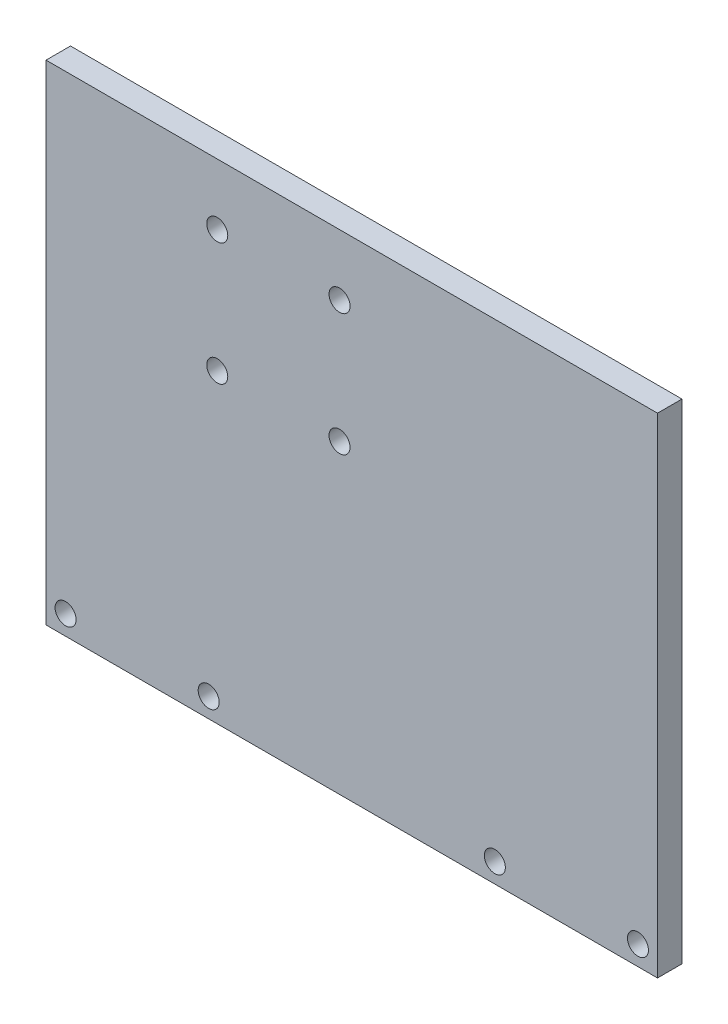
ISO-10303-21;
HEADER;
FILE_DESCRIPTION(('STEP AP214'),'2;1');
FILE_NAME('part.step','',(''),(''),'','','');
FILE_SCHEMA(('AUTOMOTIVE_DESIGN { 1 0 10303 214 1 1 1 1 }'));
ENDSEC;
DATA;
#1=APPLICATION_CONTEXT('core data for automotive mechanical design processes');
#2=APPLICATION_PROTOCOL_DEFINITION('international standard','automotive_design',2000,#1);
#3=PRODUCT_CONTEXT('',#1,'mechanical');
#4=PRODUCT('Part','Part','',(#3));
#5=PRODUCT_RELATED_PRODUCT_CATEGORY('part','',(#4));
#6=PRODUCT_DEFINITION_FORMATION('','',#4);
#7=PRODUCT_DEFINITION_CONTEXT('part definition',#1,'design');
#8=PRODUCT_DEFINITION('design','',#6,#7);
#9=PRODUCT_DEFINITION_SHAPE('','',#8);
#10=(LENGTH_UNIT() NAMED_UNIT(*) SI_UNIT(.MILLI.,.METRE.));
#11=(NAMED_UNIT(*) PLANE_ANGLE_UNIT() SI_UNIT($,.RADIAN.));
#12=(NAMED_UNIT(*) SI_UNIT($,.STERADIAN.) SOLID_ANGLE_UNIT());
#13=UNCERTAINTY_MEASURE_WITH_UNIT(LENGTH_MEASURE(1.E-05),#10,'distance_accuracy_value','');
#14=(GEOMETRIC_REPRESENTATION_CONTEXT(3) GLOBAL_UNCERTAINTY_ASSIGNED_CONTEXT((#13)) GLOBAL_UNIT_ASSIGNED_CONTEXT((#10,
#11,#12)) REPRESENTATION_CONTEXT('',''));
#15=CARTESIAN_POINT('',(0.,0.,0.));
#16=DIRECTION('',(0.,0.,1.));
#17=DIRECTION('',(1.,0.,0.));
#18=AXIS2_PLACEMENT_3D('',#15,#16,#17);
#19=CARTESIAN_POINT('',(0.,0.,2.5));
#20=DIRECTION('',(0.,0.,-1.));
#21=DIRECTION('',(-1.,0.,0.));
#22=AXIS2_PLACEMENT_3D('',#19,#20,#21);
#23=PLANE('',#22);
#24=DIRECTION('',(0.,1.,0.));
#25=VECTOR('',#24,1.);
#26=CARTESIAN_POINT('',(62.5,-50.,2.5));
#27=LINE('',#26,#25);
#28=CARTESIAN_POINT('',(62.5,-50.,2.5));
#29=VERTEX_POINT('',#28);
#30=CARTESIAN_POINT('',(62.5,50.,2.5));
#31=VERTEX_POINT('',#30);
#32=EDGE_CURVE('E92',#29,#31,#27,.T.);
#33=ORIENTED_EDGE('',*,*,#32,.T.);
#34=DIRECTION('',(-1.,0.,0.));
#35=VECTOR('',#34,1.);
#36=CARTESIAN_POINT('',(-62.5,50.,2.5));
#37=LINE('',#36,#35);
#38=CARTESIAN_POINT('',(-62.5,50.,2.5));
#39=VERTEX_POINT('',#38);
#40=EDGE_CURVE('E87',#31,#39,#37,.T.);
#41=ORIENTED_EDGE('',*,*,#40,.T.);
#42=DIRECTION('',(0.,-1.,0.));
#43=VECTOR('',#42,1.);
#44=CARTESIAN_POINT('',(-62.5,-50.,2.5));
#45=LINE('',#44,#43);
#46=CARTESIAN_POINT('',(-62.5,-50.,2.5));
#47=VERTEX_POINT('',#46);
#48=EDGE_CURVE('E90',#39,#47,#45,.T.);
#49=ORIENTED_EDGE('',*,*,#48,.T.);
#50=DIRECTION('',(1.,0.,0.));
#51=VECTOR('',#50,1.);
#52=CARTESIAN_POINT('',(-62.5,-50.,2.5));
#53=LINE('',#52,#51);
#54=EDGE_CURVE('E57',#47,#29,#53,.T.);
#55=ORIENTED_EDGE('',*,*,#54,.T.);
#56=EDGE_LOOP('',(#33,#41,#49,#55));
#57=FACE_BOUND('',#56,.T.);
#58=CARTESIAN_POINT('',(-27.5,37.5,2.5));
#59=DIRECTION('',(0.,0.,1.));
#60=DIRECTION('',(1.,0.,0.));
#61=AXIS2_PLACEMENT_3D('',#58,#59,#60);
#62=CIRCLE('',#61,2.15);
#63=CARTESIAN_POINT('',(-25.35,37.5,2.5));
#64=VERTEX_POINT('',#63);
#65=EDGE_CURVE('E112',#64,#64,#62,.T.);
#66=ORIENTED_EDGE('',*,*,#65,.F.);
#67=EDGE_LOOP('',(#66));
#68=FACE_BOUND('',#67,.T.);
#69=CARTESIAN_POINT('',(-2.5,37.5,2.5));
#70=DIRECTION('',(0.,0.,1.));
#71=DIRECTION('',(1.,0.,0.));
#72=AXIS2_PLACEMENT_3D('',#69,#70,#71);
#73=CIRCLE('',#72,2.15);
#74=CARTESIAN_POINT('',(-0.350000000000001,37.5,2.5));
#75=VERTEX_POINT('',#74);
#76=EDGE_CURVE('E134',#75,#75,#73,.T.);
#77=ORIENTED_EDGE('',*,*,#76,.F.);
#78=EDGE_LOOP('',(#77));
#79=FACE_BOUND('',#78,.T.);
#80=CARTESIAN_POINT('',(-2.5,12.5,2.5));
#81=DIRECTION('',(0.,0.,1.));
#82=DIRECTION('',(1.,0.,0.));
#83=AXIS2_PLACEMENT_3D('',#80,#81,#82);
#84=CIRCLE('',#83,2.15);
#85=CARTESIAN_POINT('',(-0.350000000000001,12.5,2.5));
#86=VERTEX_POINT('',#85);
#87=EDGE_CURVE('E142',#86,#86,#84,.T.);
#88=ORIENTED_EDGE('',*,*,#87,.F.);
#89=EDGE_LOOP('',(#88));
#90=FACE_BOUND('',#89,.T.);
#91=CARTESIAN_POINT('',(-27.5,12.5,2.5));
#92=DIRECTION('',(0.,0.,1.));
#93=DIRECTION('',(1.,0.,0.));
#94=AXIS2_PLACEMENT_3D('',#91,#92,#93);
#95=CIRCLE('',#94,2.15);
#96=CARTESIAN_POINT('',(-25.35,12.5,2.5));
#97=VERTEX_POINT('',#96);
#98=EDGE_CURVE('E150',#97,#97,#95,.T.);
#99=ORIENTED_EDGE('',*,*,#98,.F.);
#100=EDGE_LOOP('',(#99));
#101=FACE_BOUND('',#100,.T.);
#102=CARTESIAN_POINT('',(-58.5,-46.,2.5));
#103=DIRECTION('',(0.,0.,1.));
#104=DIRECTION('',(1.,0.,0.));
#105=AXIS2_PLACEMENT_3D('',#102,#103,#104);
#106=CIRCLE('',#105,2.15);
#107=CARTESIAN_POINT('',(-56.35,-46.,2.5));
#108=VERTEX_POINT('',#107);
#109=EDGE_CURVE('E158',#108,#108,#106,.T.);
#110=ORIENTED_EDGE('',*,*,#109,.F.);
#111=EDGE_LOOP('',(#110));
#112=FACE_BOUND('',#111,.T.);
#113=CARTESIAN_POINT('',(58.5,-46.,2.5));
#114=DIRECTION('',(0.,0.,1.));
#115=DIRECTION('',(1.,0.,0.));
#116=AXIS2_PLACEMENT_3D('',#113,#114,#115);
#117=CIRCLE('',#116,2.15);
#118=CARTESIAN_POINT('',(60.65,-46.,2.5));
#119=VERTEX_POINT('',#118);
#120=EDGE_CURVE('E166',#119,#119,#117,.T.);
#121=ORIENTED_EDGE('',*,*,#120,.F.);
#122=EDGE_LOOP('',(#121));
#123=FACE_BOUND('',#122,.T.);
#124=CARTESIAN_POINT('',(29.2500000000001,-46.,2.5));
#125=DIRECTION('',(0.,0.,1.));
#126=DIRECTION('',(1.,0.,0.));
#127=AXIS2_PLACEMENT_3D('',#124,#125,#126);
#128=CIRCLE('',#127,2.15);
#129=CARTESIAN_POINT('',(31.4000000000001,-46.,2.5));
#130=VERTEX_POINT('',#129);
#131=EDGE_CURVE('E174',#130,#130,#128,.T.);
#132=ORIENTED_EDGE('',*,*,#131,.F.);
#133=EDGE_LOOP('',(#132));
#134=FACE_BOUND('',#133,.T.);
#135=CARTESIAN_POINT('',(-29.2500000000001,-46.,2.5));
#136=DIRECTION('',(0.,0.,1.));
#137=DIRECTION('',(1.,0.,0.));
#138=AXIS2_PLACEMENT_3D('',#135,#136,#137);
#139=CIRCLE('',#138,2.15);
#140=CARTESIAN_POINT('',(-27.1000000000001,-46.,2.5));
#141=VERTEX_POINT('',#140);
#142=EDGE_CURVE('E182',#141,#141,#139,.T.);
#143=ORIENTED_EDGE('',*,*,#142,.F.);
#144=EDGE_LOOP('',(#143));
#145=FACE_BOUND('',#144,.T.);
#146=ADVANCED_FACE('F39',(#57,#68,#79,#90,#101,#112,#123,#134,#145),#23,.F.);
#147=CARTESIAN_POINT('',(0.,0.,-2.5));
#148=DIRECTION('',(0.,0.,-1.));
#149=DIRECTION('',(-1.,0.,0.));
#150=AXIS2_PLACEMENT_3D('',#147,#148,#149);
#151=PLANE('',#150);
#152=CARTESIAN_POINT('',(29.2500000000001,-46.,-2.5));
#153=DIRECTION('',(0.,0.,1.));
#154=DIRECTION('',(1.,0.,0.));
#155=AXIS2_PLACEMENT_3D('',#152,#153,#154);
#156=CIRCLE('',#155,2.15);
#157=CARTESIAN_POINT('',(31.4000000000001,-46.,-2.5));
#158=VERTEX_POINT('',#157);
#159=EDGE_CURVE('E178',#158,#158,#156,.T.);
#160=ORIENTED_EDGE('',*,*,#159,.T.);
#161=EDGE_LOOP('',(#160));
#162=FACE_BOUND('',#161,.T.);
#163=CARTESIAN_POINT('',(-58.5,-46.,-2.5));
#164=DIRECTION('',(0.,0.,1.));
#165=DIRECTION('',(1.,0.,0.));
#166=AXIS2_PLACEMENT_3D('',#163,#164,#165);
#167=CIRCLE('',#166,2.15);
#168=CARTESIAN_POINT('',(-56.35,-46.,-2.5));
#169=VERTEX_POINT('',#168);
#170=EDGE_CURVE('E162',#169,#169,#167,.T.);
#171=ORIENTED_EDGE('',*,*,#170,.T.);
#172=EDGE_LOOP('',(#171));
#173=FACE_BOUND('',#172,.T.);
#174=CARTESIAN_POINT('',(-2.5,12.5,-2.5));
#175=DIRECTION('',(0.,0.,1.));
#176=DIRECTION('',(1.,0.,0.));
#177=AXIS2_PLACEMENT_3D('',#174,#175,#176);
#178=CIRCLE('',#177,2.15);
#179=CARTESIAN_POINT('',(-0.350000000000001,12.5,-2.5));
#180=VERTEX_POINT('',#179);
#181=EDGE_CURVE('E146',#180,#180,#178,.T.);
#182=ORIENTED_EDGE('',*,*,#181,.T.);
#183=EDGE_LOOP('',(#182));
#184=FACE_BOUND('',#183,.T.);
#185=CARTESIAN_POINT('',(-27.5,37.5,-2.5));
#186=DIRECTION('',(0.,0.,1.));
#187=DIRECTION('',(1.,0.,0.));
#188=AXIS2_PLACEMENT_3D('',#185,#186,#187);
#189=CIRCLE('',#188,2.15);
#190=CARTESIAN_POINT('',(-25.35,37.5,-2.5));
#191=VERTEX_POINT('',#190);
#192=EDGE_CURVE('E130',#191,#191,#189,.T.);
#193=ORIENTED_EDGE('',*,*,#192,.T.);
#194=EDGE_LOOP('',(#193));
#195=FACE_BOUND('',#194,.T.);
#196=DIRECTION('',(0.,1.,0.));
#197=VECTOR('',#196,1.);
#198=CARTESIAN_POINT('',(62.5,-50.,-2.5));
#199=LINE('',#198,#197);
#200=CARTESIAN_POINT('',(62.5,-50.,-2.5));
#201=VERTEX_POINT('',#200);
#202=CARTESIAN_POINT('',(62.5,50.,-2.5));
#203=VERTEX_POINT('',#202);
#204=EDGE_CURVE('E108',#201,#203,#199,.T.);
#205=ORIENTED_EDGE('',*,*,#204,.F.);
#206=DIRECTION('',(1.,0.,0.));
#207=VECTOR('',#206,1.);
#208=CARTESIAN_POINT('',(-62.5,-50.,-2.5));
#209=LINE('',#208,#207);
#210=CARTESIAN_POINT('',(-62.5,-50.,-2.5));
#211=VERTEX_POINT('',#210);
#212=EDGE_CURVE('E80',#211,#201,#209,.T.);
#213=ORIENTED_EDGE('',*,*,#212,.F.);
#214=DIRECTION('',(0.,-1.,0.));
#215=VECTOR('',#214,1.);
#216=CARTESIAN_POINT('',(-62.5,-50.,-2.5));
#217=LINE('',#216,#215);
#218=CARTESIAN_POINT('',(-62.5,50.,-2.5));
#219=VERTEX_POINT('',#218);
#220=EDGE_CURVE('E74',#219,#211,#217,.T.);
#221=ORIENTED_EDGE('',*,*,#220,.F.);
#222=DIRECTION('',(-1.,0.,0.));
#223=VECTOR('',#222,1.);
#224=CARTESIAN_POINT('',(-62.5,50.,-2.5));
#225=LINE('',#224,#223);
#226=EDGE_CURVE('E97',#203,#219,#225,.T.);
#227=ORIENTED_EDGE('',*,*,#226,.F.);
#228=EDGE_LOOP('',(#205,#213,#221,#227));
#229=FACE_BOUND('',#228,.T.);
#230=CARTESIAN_POINT('',(-2.5,37.5,-2.5));
#231=DIRECTION('',(0.,0.,1.));
#232=DIRECTION('',(1.,0.,0.));
#233=AXIS2_PLACEMENT_3D('',#230,#231,#232);
#234=CIRCLE('',#233,2.15);
#235=CARTESIAN_POINT('',(-0.350000000000001,37.5,-2.5));
#236=VERTEX_POINT('',#235);
#237=EDGE_CURVE('E138',#236,#236,#234,.T.);
#238=ORIENTED_EDGE('',*,*,#237,.T.);
#239=EDGE_LOOP('',(#238));
#240=FACE_BOUND('',#239,.T.);
#241=CARTESIAN_POINT('',(-27.5,12.5,-2.5));
#242=DIRECTION('',(0.,0.,1.));
#243=DIRECTION('',(1.,0.,0.));
#244=AXIS2_PLACEMENT_3D('',#241,#242,#243);
#245=CIRCLE('',#244,2.15);
#246=CARTESIAN_POINT('',(-25.35,12.5,-2.5));
#247=VERTEX_POINT('',#246);
#248=EDGE_CURVE('E154',#247,#247,#245,.T.);
#249=ORIENTED_EDGE('',*,*,#248,.T.);
#250=EDGE_LOOP('',(#249));
#251=FACE_BOUND('',#250,.T.);
#252=CARTESIAN_POINT('',(58.5,-46.,-2.5));
#253=DIRECTION('',(0.,0.,1.));
#254=DIRECTION('',(1.,0.,0.));
#255=AXIS2_PLACEMENT_3D('',#252,#253,#254);
#256=CIRCLE('',#255,2.15);
#257=CARTESIAN_POINT('',(60.65,-46.,-2.5));
#258=VERTEX_POINT('',#257);
#259=EDGE_CURVE('E170',#258,#258,#256,.T.);
#260=ORIENTED_EDGE('',*,*,#259,.T.);
#261=EDGE_LOOP('',(#260));
#262=FACE_BOUND('',#261,.T.);
#263=CARTESIAN_POINT('',(-29.2500000000001,-46.,-2.5));
#264=DIRECTION('',(0.,0.,1.));
#265=DIRECTION('',(1.,0.,0.));
#266=AXIS2_PLACEMENT_3D('',#263,#264,#265);
#267=CIRCLE('',#266,2.15);
#268=CARTESIAN_POINT('',(-27.1000000000001,-46.,-2.5));
#269=VERTEX_POINT('',#268);
#270=EDGE_CURVE('E186',#269,#269,#267,.T.);
#271=ORIENTED_EDGE('',*,*,#270,.T.);
#272=EDGE_LOOP('',(#271));
#273=FACE_BOUND('',#272,.T.);
#274=ADVANCED_FACE('F125',(#162,#173,#184,#195,#229,#240,#251,#262,#273),#151,.T.);
#275=CARTESIAN_POINT('',(62.5,-50.,2.5));
#276=DIRECTION('',(-1.,0.,0.));
#277=DIRECTION('',(0.,0.,1.));
#278=AXIS2_PLACEMENT_3D('',#275,#276,#277);
#279=PLANE('',#278);
#280=ORIENTED_EDGE('',*,*,#204,.T.);
#281=DIRECTION('',(0.,0.,-1.));
#282=VECTOR('',#281,1.);
#283=CARTESIAN_POINT('',(62.5,50.,2.5));
#284=LINE('',#283,#282);
#285=EDGE_CURVE('E11',#31,#203,#284,.T.);
#286=ORIENTED_EDGE('',*,*,#285,.F.);
#287=ORIENTED_EDGE('',*,*,#32,.F.);
#288=DIRECTION('',(0.,0.,-1.));
#289=VECTOR('',#288,1.);
#290=CARTESIAN_POINT('',(62.5,-50.,2.5));
#291=LINE('',#290,#289);
#292=EDGE_CURVE('E104',#29,#201,#291,.T.);
#293=ORIENTED_EDGE('',*,*,#292,.T.);
#294=EDGE_LOOP('',(#280,#286,#287,#293));
#295=FACE_BOUND('',#294,.T.);
#296=ADVANCED_FACE('F41',(#295),#279,.F.);
#297=CARTESIAN_POINT('',(-62.5,50.,2.5));
#298=DIRECTION('',(0.,-1.,0.));
#299=DIRECTION('',(0.,0.,-1.));
#300=AXIS2_PLACEMENT_3D('',#297,#298,#299);
#301=PLANE('',#300);
#302=ORIENTED_EDGE('',*,*,#226,.T.);
#303=DIRECTION('',(0.,0.,-1.));
#304=VECTOR('',#303,1.);
#305=CARTESIAN_POINT('',(-62.5,50.,2.5));
#306=LINE('',#305,#304);
#307=EDGE_CURVE('E49',#39,#219,#306,.T.);
#308=ORIENTED_EDGE('',*,*,#307,.F.);
#309=ORIENTED_EDGE('',*,*,#40,.F.);
#310=ORIENTED_EDGE('',*,*,#285,.T.);
#311=EDGE_LOOP('',(#302,#308,#309,#310));
#312=FACE_BOUND('',#311,.T.);
#313=ADVANCED_FACE('F96',(#312),#301,.F.);
#314=CARTESIAN_POINT('',(-62.5,-50.,2.5));
#315=DIRECTION('',(1.,0.,0.));
#316=DIRECTION('',(0.,0.,-1.));
#317=AXIS2_PLACEMENT_3D('',#314,#315,#316);
#318=PLANE('',#317);
#319=ORIENTED_EDGE('',*,*,#220,.T.);
#320=DIRECTION('',(0.,0.,-1.));
#321=VECTOR('',#320,1.);
#322=CARTESIAN_POINT('',(-62.5,-50.,2.5));
#323=LINE('',#322,#321);
#324=EDGE_CURVE('E99',#47,#211,#323,.T.);
#325=ORIENTED_EDGE('',*,*,#324,.F.);
#326=ORIENTED_EDGE('',*,*,#48,.F.);
#327=ORIENTED_EDGE('',*,*,#307,.T.);
#328=EDGE_LOOP('',(#319,#325,#326,#327));
#329=FACE_BOUND('',#328,.T.);
#330=ADVANCED_FACE('F100',(#329),#318,.F.);
#331=CARTESIAN_POINT('',(-62.5,-50.,2.5));
#332=DIRECTION('',(0.,1.,0.));
#333=DIRECTION('',(0.,0.,1.));
#334=AXIS2_PLACEMENT_3D('',#331,#332,#333);
#335=PLANE('',#334);
#336=ORIENTED_EDGE('',*,*,#212,.T.);
#337=ORIENTED_EDGE('',*,*,#292,.F.);
#338=ORIENTED_EDGE('',*,*,#54,.F.);
#339=ORIENTED_EDGE('',*,*,#324,.T.);
#340=EDGE_LOOP('',(#336,#337,#338,#339));
#341=FACE_BOUND('',#340,.T.);
#342=ADVANCED_FACE('F122',(#341),#335,.F.);
#343=CARTESIAN_POINT('',(-27.5,37.5,2.5));
#344=DIRECTION('',(0.,0.,-1.));
#345=DIRECTION('',(-1.,0.,0.));
#346=AXIS2_PLACEMENT_3D('',#343,#344,#345);
#347=CYLINDRICAL_SURFACE('',#346,2.15);
#348=ORIENTED_EDGE('',*,*,#65,.T.);
#349=EDGE_LOOP('',(#348));
#350=FACE_BOUND('',#349,.T.);
#351=ORIENTED_EDGE('',*,*,#192,.F.);
#352=EDGE_LOOP('',(#351));
#353=FACE_BOUND('',#352,.T.);
#354=ADVANCED_FACE('F205',(#350,#353),#347,.F.);
#355=CARTESIAN_POINT('',(-2.5,37.5,2.5));
#356=DIRECTION('',(0.,0.,-1.));
#357=DIRECTION('',(-1.,0.,0.));
#358=AXIS2_PLACEMENT_3D('',#355,#356,#357);
#359=CYLINDRICAL_SURFACE('',#358,2.15);
#360=ORIENTED_EDGE('',*,*,#76,.T.);
#361=EDGE_LOOP('',(#360));
#362=FACE_BOUND('',#361,.T.);
#363=ORIENTED_EDGE('',*,*,#237,.F.);
#364=EDGE_LOOP('',(#363));
#365=FACE_BOUND('',#364,.T.);
#366=ADVANCED_FACE('F251',(#362,#365),#359,.F.);
#367=CARTESIAN_POINT('',(-2.5,12.5,2.5));
#368=DIRECTION('',(0.,0.,-1.));
#369=DIRECTION('',(-1.,0.,0.));
#370=AXIS2_PLACEMENT_3D('',#367,#368,#369);
#371=CYLINDRICAL_SURFACE('',#370,2.15);
#372=ORIENTED_EDGE('',*,*,#87,.T.);
#373=EDGE_LOOP('',(#372));
#374=FACE_BOUND('',#373,.T.);
#375=ORIENTED_EDGE('',*,*,#181,.F.);
#376=EDGE_LOOP('',(#375));
#377=FACE_BOUND('',#376,.T.);
#378=ADVANCED_FACE('F259',(#374,#377),#371,.F.);
#379=CARTESIAN_POINT('',(-27.5,12.5,2.5));
#380=DIRECTION('',(0.,0.,-1.));
#381=DIRECTION('',(-1.,0.,0.));
#382=AXIS2_PLACEMENT_3D('',#379,#380,#381);
#383=CYLINDRICAL_SURFACE('',#382,2.15);
#384=ORIENTED_EDGE('',*,*,#98,.T.);
#385=EDGE_LOOP('',(#384));
#386=FACE_BOUND('',#385,.T.);
#387=ORIENTED_EDGE('',*,*,#248,.F.);
#388=EDGE_LOOP('',(#387));
#389=FACE_BOUND('',#388,.T.);
#390=ADVANCED_FACE('F267',(#386,#389),#383,.F.);
#391=CARTESIAN_POINT('',(-58.5,-46.,2.5));
#392=DIRECTION('',(0.,0.,-1.));
#393=DIRECTION('',(-1.,0.,0.));
#394=AXIS2_PLACEMENT_3D('',#391,#392,#393);
#395=CYLINDRICAL_SURFACE('',#394,2.15);
#396=ORIENTED_EDGE('',*,*,#109,.T.);
#397=EDGE_LOOP('',(#396));
#398=FACE_BOUND('',#397,.T.);
#399=ORIENTED_EDGE('',*,*,#170,.F.);
#400=EDGE_LOOP('',(#399));
#401=FACE_BOUND('',#400,.T.);
#402=ADVANCED_FACE('F276',(#398,#401),#395,.F.);
#403=CARTESIAN_POINT('',(58.5,-46.,2.5));
#404=DIRECTION('',(0.,0.,-1.));
#405=DIRECTION('',(-1.,0.,0.));
#406=AXIS2_PLACEMENT_3D('',#403,#404,#405);
#407=CYLINDRICAL_SURFACE('',#406,2.15);
#408=ORIENTED_EDGE('',*,*,#120,.T.);
#409=EDGE_LOOP('',(#408));
#410=FACE_BOUND('',#409,.T.);
#411=ORIENTED_EDGE('',*,*,#259,.F.);
#412=EDGE_LOOP('',(#411));
#413=FACE_BOUND('',#412,.T.);
#414=ADVANCED_FACE('F285',(#410,#413),#407,.F.);
#415=CARTESIAN_POINT('',(29.2500000000001,-46.,2.5));
#416=DIRECTION('',(0.,0.,-1.));
#417=DIRECTION('',(-1.,0.,0.));
#418=AXIS2_PLACEMENT_3D('',#415,#416,#417);
#419=CYLINDRICAL_SURFACE('',#418,2.15);
#420=ORIENTED_EDGE('',*,*,#131,.T.);
#421=EDGE_LOOP('',(#420));
#422=FACE_BOUND('',#421,.T.);
#423=ORIENTED_EDGE('',*,*,#159,.F.);
#424=EDGE_LOOP('',(#423));
#425=FACE_BOUND('',#424,.T.);
#426=ADVANCED_FACE('F294',(#422,#425),#419,.F.);
#427=CARTESIAN_POINT('',(-29.2500000000001,-46.,2.5));
#428=DIRECTION('',(0.,0.,-1.));
#429=DIRECTION('',(-1.,0.,0.));
#430=AXIS2_PLACEMENT_3D('',#427,#428,#429);
#431=CYLINDRICAL_SURFACE('',#430,2.15);
#432=ORIENTED_EDGE('',*,*,#142,.T.);
#433=EDGE_LOOP('',(#432));
#434=FACE_BOUND('',#433,.T.);
#435=ORIENTED_EDGE('',*,*,#270,.F.);
#436=EDGE_LOOP('',(#435));
#437=FACE_BOUND('',#436,.T.);
#438=ADVANCED_FACE('F194',(#434,#437),#431,.F.);
#439=CLOSED_SHELL('',(#146,#274,#296,#313,#330,#342,#354,#366,#378,#390,#402,#414,#426,#438));
#440=MANIFOLD_SOLID_BREP('B2',#439);
#441=ADVANCED_BREP_SHAPE_REPRESENTATION('',(#18,#440),#14);
#442=SHAPE_DEFINITION_REPRESENTATION(#9,#441);
ENDSEC;
END-ISO-10303-21;
